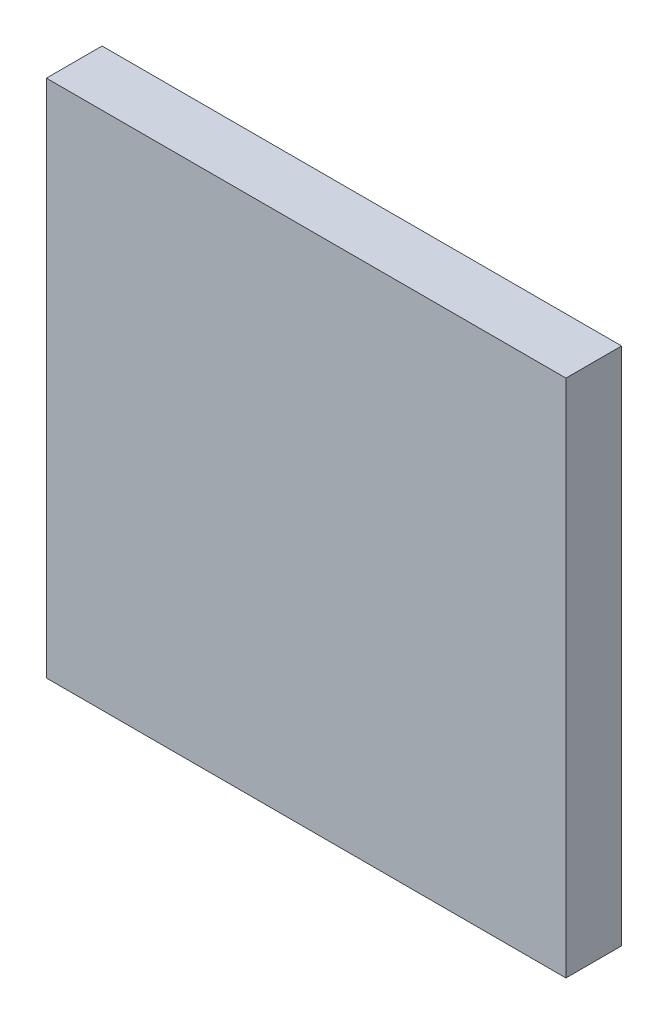
ISO-10303-21;
HEADER;
FILE_DESCRIPTION(('STEP AP214'),'2;1');
FILE_NAME('part.step','',(''),(''),'','','');
FILE_SCHEMA(('AUTOMOTIVE_DESIGN { 1 0 10303 214 1 1 1 1 }'));
ENDSEC;
DATA;
#1=APPLICATION_CONTEXT('core data for automotive mechanical design processes');
#2=APPLICATION_PROTOCOL_DEFINITION('international standard','automotive_design',2000,#1);
#3=PRODUCT_CONTEXT('',#1,'mechanical');
#4=PRODUCT('Part','Part','',(#3));
#5=PRODUCT_RELATED_PRODUCT_CATEGORY('part','',(#4));
#6=PRODUCT_DEFINITION_FORMATION('','',#4);
#7=PRODUCT_DEFINITION_CONTEXT('part definition',#1,'design');
#8=PRODUCT_DEFINITION('design','',#6,#7);
#9=PRODUCT_DEFINITION_SHAPE('','',#8);
#10=(LENGTH_UNIT() NAMED_UNIT(*) SI_UNIT(.MILLI.,.METRE.));
#11=(NAMED_UNIT(*) PLANE_ANGLE_UNIT() SI_UNIT($,.RADIAN.));
#12=(NAMED_UNIT(*) SI_UNIT($,.STERADIAN.) SOLID_ANGLE_UNIT());
#13=UNCERTAINTY_MEASURE_WITH_UNIT(LENGTH_MEASURE(1.E-05),#10,'distance_accuracy_value','');
#14=(GEOMETRIC_REPRESENTATION_CONTEXT(3) GLOBAL_UNCERTAINTY_ASSIGNED_CONTEXT((#13)) GLOBAL_UNIT_ASSIGNED_CONTEXT((#10,
#11,#12)) REPRESENTATION_CONTEXT('',''));
#15=CARTESIAN_POINT('',(0.,0.,0.));
#16=DIRECTION('',(0.,0.,1.));
#17=DIRECTION('',(1.,0.,0.));
#18=AXIS2_PLACEMENT_3D('',#15,#16,#17);
#19=CARTESIAN_POINT('',(14.,14.,3.));
#20=DIRECTION('',(-1.,0.,0.));
#21=DIRECTION('',(0.,-1.,0.));
#22=AXIS2_PLACEMENT_3D('',#19,#20,#21);
#23=PLANE('',#22);
#24=DIRECTION('',(0.,1.,0.));
#25=VECTOR('',#24,1.);
#26=CARTESIAN_POINT('',(14.,14.,0.));
#27=LINE('',#26,#25);
#28=CARTESIAN_POINT('',(14.,-14.,0.));
#29=VERTEX_POINT('',#28);
#30=CARTESIAN_POINT('',(14.,14.,0.));
#31=VERTEX_POINT('',#30);
#32=EDGE_CURVE('E102',#29,#31,#27,.T.);
#33=ORIENTED_EDGE('',*,*,#32,.T.);
#34=DIRECTION('',(0.,0.,-1.));
#35=VECTOR('',#34,1.);
#36=CARTESIAN_POINT('',(14.,14.,3.));
#37=LINE('',#36,#35);
#38=CARTESIAN_POINT('',(14.,14.,3.));
#39=VERTEX_POINT('',#38);
#40=EDGE_CURVE('E11',#39,#31,#37,.T.);
#41=ORIENTED_EDGE('',*,*,#40,.F.);
#42=DIRECTION('',(0.,1.,0.));
#43=VECTOR('',#42,1.);
#44=CARTESIAN_POINT('',(14.,14.,3.));
#45=LINE('',#44,#43);
#46=CARTESIAN_POINT('',(14.,-14.,3.));
#47=VERTEX_POINT('',#46);
#48=EDGE_CURVE('E90',#47,#39,#45,.T.);
#49=ORIENTED_EDGE('',*,*,#48,.F.);
#50=DIRECTION('',(0.,0.,-1.));
#51=VECTOR('',#50,1.);
#52=CARTESIAN_POINT('',(14.,-14.,3.));
#53=LINE('',#52,#51);
#54=EDGE_CURVE('E98',#47,#29,#53,.T.);
#55=ORIENTED_EDGE('',*,*,#54,.T.);
#56=EDGE_LOOP('',(#33,#41,#49,#55));
#57=FACE_BOUND('',#56,.T.);
#58=ADVANCED_FACE('F39',(#57),#23,.F.);
#59=CARTESIAN_POINT('',(-14.,14.,3.));
#60=DIRECTION('',(0.,-1.,0.));
#61=DIRECTION('',(0.,0.,-1.));
#62=AXIS2_PLACEMENT_3D('',#59,#60,#61);
#63=PLANE('',#62);
#64=DIRECTION('',(-1.,0.,0.));
#65=VECTOR('',#64,1.);
#66=CARTESIAN_POINT('',(-14.,14.,0.));
#67=LINE('',#66,#65);
#68=CARTESIAN_POINT('',(-14.,14.,0.));
#69=VERTEX_POINT('',#68);
#70=EDGE_CURVE('E94',#31,#69,#67,.T.);
#71=ORIENTED_EDGE('',*,*,#70,.T.);
#72=DIRECTION('',(0.,0.,-1.));
#73=VECTOR('',#72,1.);
#74=CARTESIAN_POINT('',(-14.,14.,3.));
#75=LINE('',#74,#73);
#76=CARTESIAN_POINT('',(-14.,14.,3.));
#77=VERTEX_POINT('',#76);
#78=EDGE_CURVE('E47',#77,#69,#75,.T.);
#79=ORIENTED_EDGE('',*,*,#78,.F.);
#80=DIRECTION('',(-1.,0.,0.));
#81=VECTOR('',#80,1.);
#82=CARTESIAN_POINT('',(-14.,14.,3.));
#83=LINE('',#82,#81);
#84=EDGE_CURVE('E85',#39,#77,#83,.T.);
#85=ORIENTED_EDGE('',*,*,#84,.F.);
#86=ORIENTED_EDGE('',*,*,#40,.T.);
#87=EDGE_LOOP('',(#71,#79,#85,#86));
#88=FACE_BOUND('',#87,.T.);
#89=ADVANCED_FACE('F93',(#88),#63,.F.);
#90=CARTESIAN_POINT('',(-14.,14.,3.));
#91=DIRECTION('',(1.,0.,0.));
#92=DIRECTION('',(0.,1.,0.));
#93=AXIS2_PLACEMENT_3D('',#90,#91,#92);
#94=PLANE('',#93);
#95=DIRECTION('',(0.,-1.,0.));
#96=VECTOR('',#95,1.);
#97=CARTESIAN_POINT('',(-14.,14.,0.));
#98=LINE('',#97,#96);
#99=CARTESIAN_POINT('',(-14.,-14.,0.));
#100=VERTEX_POINT('',#99);
#101=EDGE_CURVE('E72',#69,#100,#98,.T.);
#102=ORIENTED_EDGE('',*,*,#101,.T.);
#103=DIRECTION('',(0.,0.,-1.));
#104=VECTOR('',#103,1.);
#105=CARTESIAN_POINT('',(-14.,-14.,3.));
#106=LINE('',#105,#104);
#107=CARTESIAN_POINT('',(-14.,-14.,3.));
#108=VERTEX_POINT('',#107);
#109=EDGE_CURVE('E95',#108,#100,#106,.T.);
#110=ORIENTED_EDGE('',*,*,#109,.F.);
#111=DIRECTION('',(0.,-1.,0.));
#112=VECTOR('',#111,1.);
#113=CARTESIAN_POINT('',(-14.,14.,3.));
#114=LINE('',#113,#112);
#115=EDGE_CURVE('E88',#77,#108,#114,.T.);
#116=ORIENTED_EDGE('',*,*,#115,.F.);
#117=ORIENTED_EDGE('',*,*,#78,.T.);
#118=EDGE_LOOP('',(#102,#110,#116,#117));
#119=FACE_BOUND('',#118,.T.);
#120=ADVANCED_FACE('F96',(#119),#94,.F.);
#121=CARTESIAN_POINT('',(-14.,-14.,3.));
#122=DIRECTION('',(0.,1.,0.));
#123=DIRECTION('',(0.,0.,1.));
#124=AXIS2_PLACEMENT_3D('',#121,#122,#123);
#125=PLANE('',#124);
#126=DIRECTION('',(1.,0.,0.));
#127=VECTOR('',#126,1.);
#128=CARTESIAN_POINT('',(-14.,-14.,0.));
#129=LINE('',#128,#127);
#130=EDGE_CURVE('E78',#100,#29,#129,.T.);
#131=ORIENTED_EDGE('',*,*,#130,.T.);
#132=ORIENTED_EDGE('',*,*,#54,.F.);
#133=DIRECTION('',(1.,0.,0.));
#134=VECTOR('',#133,1.);
#135=CARTESIAN_POINT('',(-14.,-14.,3.));
#136=LINE('',#135,#134);
#137=EDGE_CURVE('E55',#108,#47,#136,.T.);
#138=ORIENTED_EDGE('',*,*,#137,.F.);
#139=ORIENTED_EDGE('',*,*,#109,.T.);
#140=EDGE_LOOP('',(#131,#132,#138,#139));
#141=FACE_BOUND('',#140,.T.);
#142=ADVANCED_FACE('F109',(#141),#125,.F.);
#143=CARTESIAN_POINT('',(0.,0.,3.));
#144=DIRECTION('',(0.,0.,1.));
#145=DIRECTION('',(1.,0.,0.));
#146=AXIS2_PLACEMENT_3D('',#143,#144,#145);
#147=PLANE('',#146);
#148=ORIENTED_EDGE('',*,*,#48,.T.);
#149=ORIENTED_EDGE('',*,*,#84,.T.);
#150=ORIENTED_EDGE('',*,*,#115,.T.);
#151=ORIENTED_EDGE('',*,*,#137,.T.);
#152=EDGE_LOOP('',(#148,#149,#150,#151));
#153=FACE_BOUND('',#152,.T.);
#154=ADVANCED_FACE('F86',(#153),#147,.T.);
#155=CARTESIAN_POINT('',(0.,0.,0.));
#156=DIRECTION('',(0.,0.,1.));
#157=DIRECTION('',(1.,0.,0.));
#158=AXIS2_PLACEMENT_3D('',#155,#156,#157);
#159=PLANE('',#158);
#160=ORIENTED_EDGE('',*,*,#32,.F.);
#161=ORIENTED_EDGE('',*,*,#130,.F.);
#162=ORIENTED_EDGE('',*,*,#101,.F.);
#163=ORIENTED_EDGE('',*,*,#70,.F.);
#164=EDGE_LOOP('',(#160,#161,#162,#163));
#165=FACE_BOUND('',#164,.T.);
#166=ADVANCED_FACE('F112',(#165),#159,.F.);
#167=CLOSED_SHELL('',(#58,#89,#120,#142,#154,#166));
#168=MANIFOLD_SOLID_BREP('B2',#167);
#169=ADVANCED_BREP_SHAPE_REPRESENTATION('',(#18,#168),#14);
#170=SHAPE_DEFINITION_REPRESENTATION(#9,#169);
ENDSEC;
END-ISO-10303-21;
